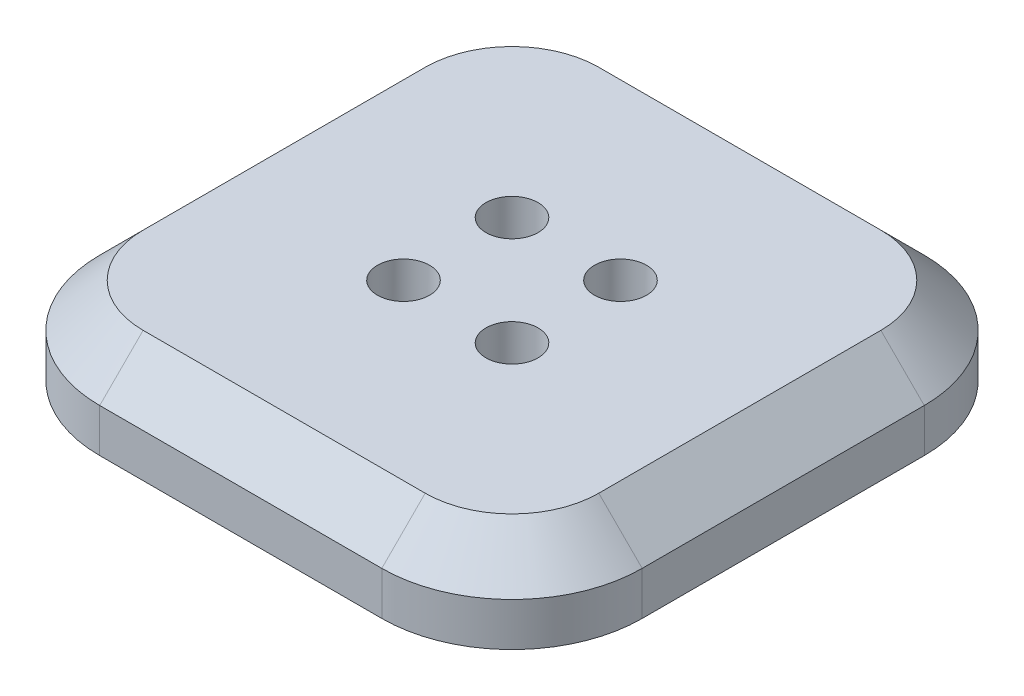
ISO-10303-21;
HEADER;
FILE_DESCRIPTION(('STEP AP214'),'2;1');
FILE_NAME('part.step','',(''),(''),'','','');
FILE_SCHEMA(('AUTOMOTIVE_DESIGN { 1 0 10303 214 1 1 1 1 }'));
ENDSEC;
DATA;
#1=APPLICATION_CONTEXT('core data for automotive mechanical design processes');
#2=APPLICATION_PROTOCOL_DEFINITION('international standard','automotive_design',2000,#1);
#3=PRODUCT_CONTEXT('',#1,'mechanical');
#4=PRODUCT('Part','Part','',(#3));
#5=PRODUCT_RELATED_PRODUCT_CATEGORY('part','',(#4));
#6=PRODUCT_DEFINITION_FORMATION('','',#4);
#7=PRODUCT_DEFINITION_CONTEXT('part definition',#1,'design');
#8=PRODUCT_DEFINITION('design','',#6,#7);
#9=PRODUCT_DEFINITION_SHAPE('','',#8);
#10=(LENGTH_UNIT() NAMED_UNIT(*) SI_UNIT(.MILLI.,.METRE.));
#11=(NAMED_UNIT(*) PLANE_ANGLE_UNIT() SI_UNIT($,.RADIAN.));
#12=(NAMED_UNIT(*) SI_UNIT($,.STERADIAN.) SOLID_ANGLE_UNIT());
#13=UNCERTAINTY_MEASURE_WITH_UNIT(LENGTH_MEASURE(1.E-05),#10,'distance_accuracy_value','');
#14=(GEOMETRIC_REPRESENTATION_CONTEXT(3) GLOBAL_UNCERTAINTY_ASSIGNED_CONTEXT((#13)) GLOBAL_UNIT_ASSIGNED_CONTEXT((#10,
#11,#12)) REPRESENTATION_CONTEXT('',''));
#15=CARTESIAN_POINT('',(0.,0.,0.));
#16=DIRECTION('',(0.,0.,1.));
#17=DIRECTION('',(1.,0.,0.));
#18=AXIS2_PLACEMENT_3D('',#15,#16,#17);
#19=CARTESIAN_POINT('',(-32.5000000000001,10.,32.5000000000001));
#20=DIRECTION('',(0.,-1.,0.));
#21=DIRECTION('',(0.,0.,-1.));
#22=AXIS2_PLACEMENT_3D('',#19,#20,#21);
#23=CYLINDRICAL_SURFACE('',#22,30.);
#24=DIRECTION('',(0.,-1.,0.));
#25=VECTOR('',#24,1.);
#26=CARTESIAN_POINT('',(-32.5000000000001,10.,62.5000000000001));
#27=LINE('',#26,#25);
#28=CARTESIAN_POINT('',(-32.5000000000001,0.,62.5000000000001));
#29=VERTEX_POINT('',#28);
#30=CARTESIAN_POINT('',(-32.5000000000001,-10.,62.5000000000001));
#31=VERTEX_POINT('',#30);
#32=EDGE_CURVE('E133',#29,#31,#27,.T.);
#33=ORIENTED_EDGE('',*,*,#32,.F.);
#34=CARTESIAN_POINT('',(-32.5000000000001,0.,32.5000000000001));
#35=DIRECTION('',(0.,-1.,0.));
#36=DIRECTION('',(0.,0.,-1.));
#37=AXIS2_PLACEMENT_3D('',#34,#35,#36);
#38=CIRCLE('',#37,30.);
#39=CARTESIAN_POINT('',(-62.5,0.,32.5000000000001));
#40=VERTEX_POINT('',#39);
#41=EDGE_CURVE('E12',#29,#40,#38,.T.);
#42=ORIENTED_EDGE('',*,*,#41,.T.);
#43=DIRECTION('',(0.,-1.,0.));
#44=VECTOR('',#43,1.);
#45=CARTESIAN_POINT('',(-62.5,10.,32.5000000000001));
#46=LINE('',#45,#44);
#47=CARTESIAN_POINT('',(-62.5,-10.,32.5000000000001));
#48=VERTEX_POINT('',#47);
#49=EDGE_CURVE('E156',#40,#48,#46,.T.);
#50=ORIENTED_EDGE('',*,*,#49,.T.);
#51=CARTESIAN_POINT('',(-32.5000000000001,-10.,32.5000000000001));
#52=DIRECTION('',(0.,1.,0.));
#53=DIRECTION('',(0.,0.,-1.));
#54=AXIS2_PLACEMENT_3D('',#51,#52,#53);
#55=CIRCLE('',#54,30.);
#56=EDGE_CURVE('E149',#48,#31,#55,.T.);
#57=ORIENTED_EDGE('',*,*,#56,.T.);
#58=EDGE_LOOP('',(#33,#42,#50,#57));
#59=FACE_BOUND('',#58,.T.);
#60=ADVANCED_FACE('F43',(#59),#23,.T.);
#61=CARTESIAN_POINT('',(32.5000000000001,10.,62.5000000000001));
#62=DIRECTION('',(0.,0.,-1.));
#63=DIRECTION('',(-1.,0.,0.));
#64=AXIS2_PLACEMENT_3D('',#61,#62,#63);
#65=PLANE('',#64);
#66=DIRECTION('',(0.,-1.,0.));
#67=VECTOR('',#66,1.);
#68=CARTESIAN_POINT('',(32.5000000000001,10.,62.5000000000001));
#69=LINE('',#68,#67);
#70=CARTESIAN_POINT('',(32.5000000000001,0.,62.5000000000001));
#71=VERTEX_POINT('',#70);
#72=CARTESIAN_POINT('',(32.5000000000001,-10.,62.5000000000001));
#73=VERTEX_POINT('',#72);
#74=EDGE_CURVE('E143',#71,#73,#69,.T.);
#75=ORIENTED_EDGE('',*,*,#74,.F.);
#76=DIRECTION('',(-1.,0.,0.));
#77=VECTOR('',#76,1.);
#78=CARTESIAN_POINT('',(32.5000000000001,0.,62.5000000000001));
#79=LINE('',#78,#77);
#80=EDGE_CURVE('E54',#71,#29,#79,.T.);
#81=ORIENTED_EDGE('',*,*,#80,.T.);
#82=ORIENTED_EDGE('',*,*,#32,.T.);
#83=DIRECTION('',(1.,0.,0.));
#84=VECTOR('',#83,1.);
#85=CARTESIAN_POINT('',(32.5000000000001,-10.,62.5000000000001));
#86=LINE('',#85,#84);
#87=EDGE_CURVE('E136',#31,#73,#86,.T.);
#88=ORIENTED_EDGE('',*,*,#87,.T.);
#89=EDGE_LOOP('',(#75,#81,#82,#88));
#90=FACE_BOUND('',#89,.T.);
#91=ADVANCED_FACE('F135',(#90),#65,.F.);
#92=CARTESIAN_POINT('',(32.5000000000001,10.,32.5000000000001));
#93=DIRECTION('',(0.,-1.,0.));
#94=DIRECTION('',(0.,0.,-1.));
#95=AXIS2_PLACEMENT_3D('',#92,#93,#94);
#96=CYLINDRICAL_SURFACE('',#95,30.);
#97=DIRECTION('',(0.,-1.,0.));
#98=VECTOR('',#97,1.);
#99=CARTESIAN_POINT('',(62.5000000000001,10.,32.5000000000001));
#100=LINE('',#99,#98);
#101=CARTESIAN_POINT('',(62.5000000000001,0.,32.5000000000001));
#102=VERTEX_POINT('',#101);
#103=CARTESIAN_POINT('',(62.5000000000001,-10.,32.5000000000001));
#104=VERTEX_POINT('',#103);
#105=EDGE_CURVE('E202',#102,#104,#100,.T.);
#106=ORIENTED_EDGE('',*,*,#105,.F.);
#107=CARTESIAN_POINT('',(32.5000000000001,0.,32.5000000000001));
#108=DIRECTION('',(0.,-1.,0.));
#109=DIRECTION('',(0.,0.,-1.));
#110=AXIS2_PLACEMENT_3D('',#107,#108,#109);
#111=CIRCLE('',#110,30.);
#112=EDGE_CURVE('E69',#102,#71,#111,.T.);
#113=ORIENTED_EDGE('',*,*,#112,.T.);
#114=ORIENTED_EDGE('',*,*,#74,.T.);
#115=CARTESIAN_POINT('',(32.5000000000001,-10.,32.5000000000001));
#116=DIRECTION('',(0.,1.,0.));
#117=DIRECTION('',(0.,0.,-1.));
#118=AXIS2_PLACEMENT_3D('',#115,#116,#117);
#119=CIRCLE('',#118,30.);
#120=EDGE_CURVE('E152',#73,#104,#119,.T.);
#121=ORIENTED_EDGE('',*,*,#120,.T.);
#122=EDGE_LOOP('',(#106,#113,#114,#121));
#123=FACE_BOUND('',#122,.T.);
#124=ADVANCED_FACE('F329',(#123),#96,.T.);
#125=CARTESIAN_POINT('',(62.5,10.,-32.5000000000001));
#126=DIRECTION('',(-1.,0.,0.));
#127=DIRECTION('',(0.,0.,1.));
#128=AXIS2_PLACEMENT_3D('',#125,#126,#127);
#129=PLANE('',#128);
#130=DIRECTION('',(0.,-1.,0.));
#131=VECTOR('',#130,1.);
#132=CARTESIAN_POINT('',(62.5,10.,-32.5000000000001));
#133=LINE('',#132,#131);
#134=CARTESIAN_POINT('',(62.5,0.,-32.5000000000001));
#135=VERTEX_POINT('',#134);
#136=CARTESIAN_POINT('',(62.5,-10.,-32.5000000000001));
#137=VERTEX_POINT('',#136);
#138=EDGE_CURVE('E199',#135,#137,#133,.T.);
#139=ORIENTED_EDGE('',*,*,#138,.F.);
#140=DIRECTION('',(0.,0.,1.));
#141=VECTOR('',#140,1.);
#142=CARTESIAN_POINT('',(62.5,0.,-32.5000000000001));
#143=LINE('',#142,#141);
#144=EDGE_CURVE('E244',#135,#102,#143,.T.);
#145=ORIENTED_EDGE('',*,*,#144,.T.);
#146=ORIENTED_EDGE('',*,*,#105,.T.);
#147=DIRECTION('',(0.,0.,-1.));
#148=VECTOR('',#147,1.);
#149=CARTESIAN_POINT('',(62.5,-10.,-32.5000000000001));
#150=LINE('',#149,#148);
#151=EDGE_CURVE('E169',#104,#137,#150,.T.);
#152=ORIENTED_EDGE('',*,*,#151,.T.);
#153=EDGE_LOOP('',(#139,#145,#146,#152));
#154=FACE_BOUND('',#153,.T.);
#155=ADVANCED_FACE('F327',(#154),#129,.F.);
#156=CARTESIAN_POINT('',(32.5000000000001,10.,-32.5000000000001));
#157=DIRECTION('',(0.,-1.,0.));
#158=DIRECTION('',(0.,0.,-1.));
#159=AXIS2_PLACEMENT_3D('',#156,#157,#158);
#160=CYLINDRICAL_SURFACE('',#159,30.);
#161=DIRECTION('',(0.,-1.,0.));
#162=VECTOR('',#161,1.);
#163=CARTESIAN_POINT('',(32.5000000000001,10.,-62.5000000000001));
#164=LINE('',#163,#162);
#165=CARTESIAN_POINT('',(32.5000000000001,0.,-62.5000000000001));
#166=VERTEX_POINT('',#165);
#167=CARTESIAN_POINT('',(32.5000000000001,-10.,-62.5000000000001));
#168=VERTEX_POINT('',#167);
#169=EDGE_CURVE('E196',#166,#168,#164,.T.);
#170=ORIENTED_EDGE('',*,*,#169,.F.);
#171=CARTESIAN_POINT('',(32.5000000000001,0.,-32.5000000000001));
#172=DIRECTION('',(0.,-1.,0.));
#173=DIRECTION('',(0.,0.,-1.));
#174=AXIS2_PLACEMENT_3D('',#171,#172,#173);
#175=CIRCLE('',#174,30.);
#176=EDGE_CURVE('E241',#166,#135,#175,.T.);
#177=ORIENTED_EDGE('',*,*,#176,.T.);
#178=ORIENTED_EDGE('',*,*,#138,.T.);
#179=CARTESIAN_POINT('',(32.5000000000001,-10.,-32.5000000000001));
#180=DIRECTION('',(0.,1.,0.));
#181=DIRECTION('',(0.,0.,-1.));
#182=AXIS2_PLACEMENT_3D('',#179,#180,#181);
#183=CIRCLE('',#182,30.);
#184=EDGE_CURVE('E173',#137,#168,#183,.T.);
#185=ORIENTED_EDGE('',*,*,#184,.T.);
#186=EDGE_LOOP('',(#170,#177,#178,#185));
#187=FACE_BOUND('',#186,.T.);
#188=ADVANCED_FACE('F325',(#187),#160,.T.);
#189=CARTESIAN_POINT('',(-32.5000000000001,10.,-62.5000000000001));
#190=DIRECTION('',(0.,0.,1.));
#191=DIRECTION('',(1.,0.,0.));
#192=AXIS2_PLACEMENT_3D('',#189,#190,#191);
#193=PLANE('',#192);
#194=DIRECTION('',(0.,-1.,0.));
#195=VECTOR('',#194,1.);
#196=CARTESIAN_POINT('',(-32.5000000000001,10.,-62.5000000000001));
#197=LINE('',#196,#195);
#198=CARTESIAN_POINT('',(-32.5000000000001,0.,-62.5000000000001));
#199=VERTEX_POINT('',#198);
#200=CARTESIAN_POINT('',(-32.5000000000001,-10.,-62.5000000000001));
#201=VERTEX_POINT('',#200);
#202=EDGE_CURVE('E193',#199,#201,#197,.T.);
#203=ORIENTED_EDGE('',*,*,#202,.F.);
#204=DIRECTION('',(1.,0.,0.));
#205=VECTOR('',#204,1.);
#206=CARTESIAN_POINT('',(-32.5000000000001,0.,-62.5000000000001));
#207=LINE('',#206,#205);
#208=EDGE_CURVE('E238',#199,#166,#207,.T.);
#209=ORIENTED_EDGE('',*,*,#208,.T.);
#210=ORIENTED_EDGE('',*,*,#169,.T.);
#211=DIRECTION('',(-1.,0.,0.));
#212=VECTOR('',#211,1.);
#213=CARTESIAN_POINT('',(-32.5000000000001,-10.,-62.5000000000001));
#214=LINE('',#213,#212);
#215=EDGE_CURVE('E177',#168,#201,#214,.T.);
#216=ORIENTED_EDGE('',*,*,#215,.T.);
#217=EDGE_LOOP('',(#203,#209,#210,#216));
#218=FACE_BOUND('',#217,.T.);
#219=ADVANCED_FACE('F313',(#218),#193,.F.);
#220=CARTESIAN_POINT('',(-32.5000000000001,10.,-32.5000000000001));
#221=DIRECTION('',(0.,-1.,0.));
#222=DIRECTION('',(0.,0.,-1.));
#223=AXIS2_PLACEMENT_3D('',#220,#221,#222);
#224=CYLINDRICAL_SURFACE('',#223,30.);
#225=DIRECTION('',(0.,-1.,0.));
#226=VECTOR('',#225,1.);
#227=CARTESIAN_POINT('',(-62.5000000000001,10.,-32.5000000000001));
#228=LINE('',#227,#226);
#229=CARTESIAN_POINT('',(-62.5000000000001,0.,-32.5000000000001));
#230=VERTEX_POINT('',#229);
#231=CARTESIAN_POINT('',(-62.5000000000001,-10.,-32.5000000000001));
#232=VERTEX_POINT('',#231);
#233=EDGE_CURVE('E190',#230,#232,#228,.T.);
#234=ORIENTED_EDGE('',*,*,#233,.F.);
#235=CARTESIAN_POINT('',(-32.5000000000001,0.,-32.5000000000001));
#236=DIRECTION('',(0.,-1.,0.));
#237=DIRECTION('',(0.,0.,-1.));
#238=AXIS2_PLACEMENT_3D('',#235,#236,#237);
#239=CIRCLE('',#238,30.);
#240=EDGE_CURVE('E235',#230,#199,#239,.T.);
#241=ORIENTED_EDGE('',*,*,#240,.T.);
#242=ORIENTED_EDGE('',*,*,#202,.T.);
#243=CARTESIAN_POINT('',(-32.5000000000001,-10.,-32.5000000000001));
#244=DIRECTION('',(0.,1.,0.));
#245=DIRECTION('',(0.,0.,1.));
#246=AXIS2_PLACEMENT_3D('',#243,#244,#245);
#247=CIRCLE('',#246,30.);
#248=EDGE_CURVE('E181',#201,#232,#247,.T.);
#249=ORIENTED_EDGE('',*,*,#248,.T.);
#250=EDGE_LOOP('',(#234,#241,#242,#249));
#251=FACE_BOUND('',#250,.T.);
#252=ADVANCED_FACE('F310',(#251),#224,.T.);
#253=CARTESIAN_POINT('',(-62.5,10.,32.5000000000001));
#254=DIRECTION('',(1.,0.,0.));
#255=DIRECTION('',(0.,0.,-1.));
#256=AXIS2_PLACEMENT_3D('',#253,#254,#255);
#257=PLANE('',#256);
#258=ORIENTED_EDGE('',*,*,#49,.F.);
#259=DIRECTION('',(0.,0.,-1.));
#260=VECTOR('',#259,1.);
#261=CARTESIAN_POINT('',(-62.5,0.,32.5000000000001));
#262=LINE('',#261,#260);
#263=EDGE_CURVE('E231',#40,#230,#262,.T.);
#264=ORIENTED_EDGE('',*,*,#263,.T.);
#265=ORIENTED_EDGE('',*,*,#233,.T.);
#266=DIRECTION('',(0.,0.,1.));
#267=VECTOR('',#266,1.);
#268=CARTESIAN_POINT('',(-62.5,-10.,32.5000000000001));
#269=LINE('',#268,#267);
#270=EDGE_CURVE('E185',#232,#48,#269,.T.);
#271=ORIENTED_EDGE('',*,*,#270,.T.);
#272=EDGE_LOOP('',(#258,#264,#265,#271));
#273=FACE_BOUND('',#272,.T.);
#274=ADVANCED_FACE('F297',(#273),#257,.F.);
#275=CARTESIAN_POINT('',(-32.5000000000001,10.,32.5000000000001));
#276=DIRECTION('',(0.,-1.,0.));
#277=DIRECTION('',(0.,0.,-1.));
#278=AXIS2_PLACEMENT_3D('',#275,#276,#277);
#279=PLANE('',#278);
#280=CARTESIAN_POINT('',(-12.5,10.,-12.5000000000001));
#281=DIRECTION('',(0.,1.,0.));
#282=DIRECTION('',(0.,0.,-1.));
#283=AXIS2_PLACEMENT_3D('',#280,#281,#282);
#284=CIRCLE('',#283,6.);
#285=CARTESIAN_POINT('',(-12.5,10.,-18.5000000000001));
#286=VERTEX_POINT('',#285);
#287=EDGE_CURVE('E629',#286,#286,#284,.T.);
#288=ORIENTED_EDGE('',*,*,#287,.F.);
#289=EDGE_LOOP('',(#288));
#290=FACE_BOUND('',#289,.T.);
#291=CARTESIAN_POINT('',(12.5,10.,12.5000000000001));
#292=DIRECTION('',(0.,1.,0.));
#293=DIRECTION('',(0.,0.,-1.));
#294=AXIS2_PLACEMENT_3D('',#291,#292,#293);
#295=CIRCLE('',#294,6.00000000000001);
#296=CARTESIAN_POINT('',(12.5,10.,6.5000000000001));
#297=VERTEX_POINT('',#296);
#298=EDGE_CURVE('E628',#297,#297,#295,.T.);
#299=ORIENTED_EDGE('',*,*,#298,.F.);
#300=EDGE_LOOP('',(#299));
#301=FACE_BOUND('',#300,.T.);
#302=CARTESIAN_POINT('',(-12.5,10.,12.5000000000001));
#303=DIRECTION('',(0.,1.,0.));
#304=DIRECTION('',(0.,0.,1.));
#305=AXIS2_PLACEMENT_3D('',#302,#303,#304);
#306=CIRCLE('',#305,6.);
#307=CARTESIAN_POINT('',(-12.5,10.,18.5000000000001));
#308=VERTEX_POINT('',#307);
#309=EDGE_CURVE('E620',#308,#308,#306,.T.);
#310=ORIENTED_EDGE('',*,*,#309,.F.);
#311=EDGE_LOOP('',(#310));
#312=FACE_BOUND('',#311,.T.);
#313=CARTESIAN_POINT('',(12.5,10.,-12.5000000000001));
#314=DIRECTION('',(0.,1.,0.));
#315=DIRECTION('',(0.,0.,1.));
#316=AXIS2_PLACEMENT_3D('',#313,#314,#315);
#317=CIRCLE('',#316,6.00000000000001);
#318=CARTESIAN_POINT('',(12.5,10.,-6.5000000000001));
#319=VERTEX_POINT('',#318);
#320=EDGE_CURVE('E638',#319,#319,#317,.T.);
#321=ORIENTED_EDGE('',*,*,#320,.F.);
#322=EDGE_LOOP('',(#321));
#323=FACE_BOUND('',#322,.T.);
#324=CARTESIAN_POINT('',(-32.5000000000001,10.,-32.5000000000001));
#325=DIRECTION('',(0.,-1.,0.));
#326=DIRECTION('',(0.,0.,-1.));
#327=AXIS2_PLACEMENT_3D('',#324,#325,#326);
#328=CIRCLE('',#327,20.);
#329=CARTESIAN_POINT('',(-32.5000000000001,10.,-52.5000000000001));
#330=VERTEX_POINT('',#329);
#331=CARTESIAN_POINT('',(-52.5000000000001,10.,-32.5000000000001));
#332=VERTEX_POINT('',#331);
#333=EDGE_CURVE('E224',#330,#332,#328,.F.);
#334=ORIENTED_EDGE('',*,*,#333,.T.);
#335=DIRECTION('',(0.,0.,1.));
#336=VECTOR('',#335,1.);
#337=CARTESIAN_POINT('',(-52.5,10.,32.5000000000001));
#338=LINE('',#337,#336);
#339=CARTESIAN_POINT('',(-52.5,10.,32.5000000000001));
#340=VERTEX_POINT('',#339);
#341=EDGE_CURVE('E227',#332,#340,#338,.T.);
#342=ORIENTED_EDGE('',*,*,#341,.T.);
#343=CARTESIAN_POINT('',(-32.5000000000001,10.,32.5000000000001));
#344=DIRECTION('',(0.,-1.,0.));
#345=DIRECTION('',(0.,0.,-1.));
#346=AXIS2_PLACEMENT_3D('',#343,#344,#345);
#347=CIRCLE('',#346,20.);
#348=CARTESIAN_POINT('',(-32.5000000000001,10.,52.5000000000001));
#349=VERTEX_POINT('',#348);
#350=EDGE_CURVE('E142',#340,#349,#347,.F.);
#351=ORIENTED_EDGE('',*,*,#350,.T.);
#352=DIRECTION('',(1.,0.,0.));
#353=VECTOR('',#352,1.);
#354=CARTESIAN_POINT('',(-32.5000000000001,10.,52.5000000000001));
#355=LINE('',#354,#353);
#356=CARTESIAN_POINT('',(32.5000000000001,10.,52.5000000000001));
#357=VERTEX_POINT('',#356);
#358=EDGE_CURVE('E209',#349,#357,#355,.T.);
#359=ORIENTED_EDGE('',*,*,#358,.T.);
#360=CARTESIAN_POINT('',(32.5000000000001,10.,32.5000000000001));
#361=DIRECTION('',(0.,-1.,0.));
#362=DIRECTION('',(0.,0.,-1.));
#363=AXIS2_PLACEMENT_3D('',#360,#361,#362);
#364=CIRCLE('',#363,20.);
#365=CARTESIAN_POINT('',(52.5,10.,32.5000000000001));
#366=VERTEX_POINT('',#365);
#367=EDGE_CURVE('E212',#357,#366,#364,.F.);
#368=ORIENTED_EDGE('',*,*,#367,.T.);
#369=DIRECTION('',(0.,0.,-1.));
#370=VECTOR('',#369,1.);
#371=CARTESIAN_POINT('',(52.5,10.,32.5000000000001));
#372=LINE('',#371,#370);
#373=CARTESIAN_POINT('',(52.5,10.,-32.5000000000001));
#374=VERTEX_POINT('',#373);
#375=EDGE_CURVE('E215',#366,#374,#372,.T.);
#376=ORIENTED_EDGE('',*,*,#375,.T.);
#377=CARTESIAN_POINT('',(32.5000000000001,10.,-32.5000000000001));
#378=DIRECTION('',(0.,-1.,0.));
#379=DIRECTION('',(0.,0.,-1.));
#380=AXIS2_PLACEMENT_3D('',#377,#378,#379);
#381=CIRCLE('',#380,20.);
#382=CARTESIAN_POINT('',(32.5000000000001,10.,-52.5000000000001));
#383=VERTEX_POINT('',#382);
#384=EDGE_CURVE('E218',#374,#383,#381,.F.);
#385=ORIENTED_EDGE('',*,*,#384,.T.);
#386=DIRECTION('',(-1.,0.,0.));
#387=VECTOR('',#386,1.);
#388=CARTESIAN_POINT('',(-32.5000000000001,10.,-52.5000000000001));
#389=LINE('',#388,#387);
#390=EDGE_CURVE('E221',#383,#330,#389,.T.);
#391=ORIENTED_EDGE('',*,*,#390,.T.);
#392=EDGE_LOOP('',(#334,#342,#351,#359,#368,#376,#385,#391));
#393=FACE_BOUND('',#392,.T.);
#394=ADVANCED_FACE('F285',(#290,#301,#312,#323,#393),#279,.F.);
#395=CARTESIAN_POINT('',(-32.5000000000001,-10.,32.5000000000001));
#396=DIRECTION('',(0.,-1.,0.));
#397=DIRECTION('',(0.,0.,-1.));
#398=AXIS2_PLACEMENT_3D('',#395,#396,#397);
#399=PLANE('',#398);
#400=CARTESIAN_POINT('',(-37.5,-10.,37.5000000000001));
#401=DIRECTION('',(0.,-1.,0.));
#402=DIRECTION('',(0.,0.,1.));
#403=AXIS2_PLACEMENT_3D('',#400,#401,#402);
#404=CIRCLE('',#403,6.);
#405=CARTESIAN_POINT('',(-37.5,-10.,43.5000000000001));
#406=VERTEX_POINT('',#405);
#407=EDGE_CURVE('E597',#406,#406,#404,.T.);
#408=ORIENTED_EDGE('',*,*,#407,.F.);
#409=EDGE_LOOP('',(#408));
#410=FACE_BOUND('',#409,.T.);
#411=CARTESIAN_POINT('',(37.5,-10.,-37.5000000000001));
#412=DIRECTION('',(0.,-1.,0.));
#413=DIRECTION('',(0.,0.,1.));
#414=AXIS2_PLACEMENT_3D('',#411,#412,#413);
#415=CIRCLE('',#414,6.);
#416=CARTESIAN_POINT('',(37.5,-10.,-31.5000000000001));
#417=VERTEX_POINT('',#416);
#418=EDGE_CURVE('E609',#417,#417,#415,.T.);
#419=ORIENTED_EDGE('',*,*,#418,.F.);
#420=EDGE_LOOP('',(#419));
#421=FACE_BOUND('',#420,.T.);
#422=CARTESIAN_POINT('',(-37.5,-10.,-37.5000000000001));
#423=DIRECTION('',(0.,-1.,0.));
#424=DIRECTION('',(0.,0.,-1.));
#425=AXIS2_PLACEMENT_3D('',#422,#423,#424);
#426=CIRCLE('',#425,6.);
#427=CARTESIAN_POINT('',(-37.5,-10.,-43.5000000000001));
#428=VERTEX_POINT('',#427);
#429=EDGE_CURVE('E673',#428,#428,#426,.T.);
#430=ORIENTED_EDGE('',*,*,#429,.F.);
#431=EDGE_LOOP('',(#430));
#432=FACE_BOUND('',#431,.T.);
#433=CARTESIAN_POINT('',(37.5,-10.,37.5000000000001));
#434=DIRECTION('',(0.,-1.,0.));
#435=DIRECTION('',(0.,0.,-1.));
#436=AXIS2_PLACEMENT_3D('',#433,#434,#435);
#437=CIRCLE('',#436,6.);
#438=CARTESIAN_POINT('',(37.5,-10.,31.5000000000001));
#439=VERTEX_POINT('',#438);
#440=EDGE_CURVE('E596',#439,#439,#437,.T.);
#441=ORIENTED_EDGE('',*,*,#440,.F.);
#442=EDGE_LOOP('',(#441));
#443=FACE_BOUND('',#442,.T.);
#444=ORIENTED_EDGE('',*,*,#56,.F.);
#445=ORIENTED_EDGE('',*,*,#270,.F.);
#446=ORIENTED_EDGE('',*,*,#248,.F.);
#447=ORIENTED_EDGE('',*,*,#215,.F.);
#448=ORIENTED_EDGE('',*,*,#184,.F.);
#449=ORIENTED_EDGE('',*,*,#151,.F.);
#450=ORIENTED_EDGE('',*,*,#120,.F.);
#451=ORIENTED_EDGE('',*,*,#87,.F.);
#452=EDGE_LOOP('',(#444,#445,#446,#447,#448,#449,#450,#451));
#453=FACE_BOUND('',#452,.T.);
#454=ADVANCED_FACE('F147',(#410,#421,#432,#443,#453),#399,.T.);
#455=CARTESIAN_POINT('',(52.5,10.,32.5000000000001));
#456=DIRECTION('',(-0.707106781186549,-0.707106781186546,0.));
#457=DIRECTION('',(0.,0.,-1.));
#458=AXIS2_PLACEMENT_3D('',#455,#456,#457);
#459=PLANE('',#458);
#460=DIRECTION('',(-0.707106781186546,0.707106781186549,0.));
#461=VECTOR('',#460,1.);
#462=CARTESIAN_POINT('',(62.5,0.,32.5000000000001));
#463=LINE('',#462,#461);
#464=EDGE_CURVE('E162',#102,#366,#463,.T.);
#465=ORIENTED_EDGE('',*,*,#464,.F.);
#466=ORIENTED_EDGE('',*,*,#144,.F.);
#467=DIRECTION('',(0.707106781186546,-0.707106781186549,0.));
#468=VECTOR('',#467,1.);
#469=CARTESIAN_POINT('',(52.5,10.,-32.5000000000001));
#470=LINE('',#469,#468);
#471=EDGE_CURVE('E48',#374,#135,#470,.T.);
#472=ORIENTED_EDGE('',*,*,#471,.F.);
#473=ORIENTED_EDGE('',*,*,#375,.F.);
#474=EDGE_LOOP('',(#465,#466,#472,#473));
#475=FACE_BOUND('',#474,.T.);
#476=ADVANCED_FACE('F46',(#475),#459,.F.);
#477=CARTESIAN_POINT('',(32.5000000000001,10.,-32.5000000000001));
#478=DIRECTION('',(0.,-1.,0.));
#479=DIRECTION('',(0.,0.,-1.));
#480=AXIS2_PLACEMENT_3D('',#477,#478,#479);
#481=CONICAL_SURFACE('',#480,20.,0.785398163397446);
#482=ORIENTED_EDGE('',*,*,#471,.T.);
#483=ORIENTED_EDGE('',*,*,#176,.F.);
#484=DIRECTION('',(0.,-0.707106781186549,-0.707106781186546));
#485=VECTOR('',#484,1.);
#486=CARTESIAN_POINT('',(32.5000000000001,10.,-52.5000000000001));
#487=LINE('',#486,#485);
#488=EDGE_CURVE('E269',#383,#166,#487,.T.);
#489=ORIENTED_EDGE('',*,*,#488,.F.);
#490=ORIENTED_EDGE('',*,*,#384,.F.);
#491=EDGE_LOOP('',(#482,#483,#489,#490));
#492=FACE_BOUND('',#491,.T.);
#493=ADVANCED_FACE('F322',(#492),#481,.T.);
#494=CARTESIAN_POINT('',(32.5000000000001,10.,32.5000000000001));
#495=DIRECTION('',(0.,-1.,0.));
#496=DIRECTION('',(0.,0.,-1.));
#497=AXIS2_PLACEMENT_3D('',#494,#495,#496);
#498=CONICAL_SURFACE('',#497,20.,0.785398163397446);
#499=ORIENTED_EDGE('',*,*,#464,.T.);
#500=ORIENTED_EDGE('',*,*,#367,.F.);
#501=DIRECTION('',(0.,0.707106781186549,-0.707106781186546));
#502=VECTOR('',#501,1.);
#503=CARTESIAN_POINT('',(32.5000000000001,0.,62.5000000000001));
#504=LINE('',#503,#502);
#505=EDGE_CURVE('E265',#71,#357,#504,.T.);
#506=ORIENTED_EDGE('',*,*,#505,.F.);
#507=ORIENTED_EDGE('',*,*,#112,.F.);
#508=EDGE_LOOP('',(#499,#500,#506,#507));
#509=FACE_BOUND('',#508,.T.);
#510=ADVANCED_FACE('F277',(#509),#498,.T.);
#511=CARTESIAN_POINT('',(-32.5000000000001,10.,-52.5000000000001));
#512=DIRECTION('',(0.,-0.707106781186546,0.707106781186549));
#513=DIRECTION('',(-1.,0.,0.));
#514=AXIS2_PLACEMENT_3D('',#511,#512,#513);
#515=PLANE('',#514);
#516=ORIENTED_EDGE('',*,*,#488,.T.);
#517=ORIENTED_EDGE('',*,*,#208,.F.);
#518=DIRECTION('',(0.,-0.707106781186549,-0.707106781186546));
#519=VECTOR('',#518,1.);
#520=CARTESIAN_POINT('',(-32.5000000000001,10.,-52.5000000000001));
#521=LINE('',#520,#519);
#522=EDGE_CURVE('E261',#330,#199,#521,.T.);
#523=ORIENTED_EDGE('',*,*,#522,.F.);
#524=ORIENTED_EDGE('',*,*,#390,.F.);
#525=EDGE_LOOP('',(#516,#517,#523,#524));
#526=FACE_BOUND('',#525,.T.);
#527=ADVANCED_FACE('F318',(#526),#515,.F.);
#528=CARTESIAN_POINT('',(-32.5000000000001,10.,52.5000000000001));
#529=DIRECTION('',(0.,-0.707106781186546,-0.707106781186549));
#530=DIRECTION('',(1.,0.,0.));
#531=AXIS2_PLACEMENT_3D('',#528,#529,#530);
#532=PLANE('',#531);
#533=ORIENTED_EDGE('',*,*,#505,.T.);
#534=ORIENTED_EDGE('',*,*,#358,.F.);
#535=DIRECTION('',(0.,0.707106781186549,-0.707106781186546));
#536=VECTOR('',#535,1.);
#537=CARTESIAN_POINT('',(-32.5000000000001,0.,62.5000000000001));
#538=LINE('',#537,#536);
#539=EDGE_CURVE('E257',#29,#349,#538,.T.);
#540=ORIENTED_EDGE('',*,*,#539,.F.);
#541=ORIENTED_EDGE('',*,*,#80,.F.);
#542=EDGE_LOOP('',(#533,#534,#540,#541));
#543=FACE_BOUND('',#542,.T.);
#544=ADVANCED_FACE('F290',(#543),#532,.F.);
#545=CARTESIAN_POINT('',(-32.5000000000001,10.,-32.5000000000001));
#546=DIRECTION('',(0.,-1.,0.));
#547=DIRECTION('',(0.,0.,-1.));
#548=AXIS2_PLACEMENT_3D('',#545,#546,#547);
#549=CONICAL_SURFACE('',#548,20.,0.785398163397446);
#550=ORIENTED_EDGE('',*,*,#522,.T.);
#551=ORIENTED_EDGE('',*,*,#240,.F.);
#552=DIRECTION('',(-0.707106781186546,-0.707106781186549,0.));
#553=VECTOR('',#552,1.);
#554=CARTESIAN_POINT('',(-52.5000000000001,10.,-32.5000000000001));
#555=LINE('',#554,#553);
#556=EDGE_CURVE('E254',#332,#230,#555,.T.);
#557=ORIENTED_EDGE('',*,*,#556,.F.);
#558=ORIENTED_EDGE('',*,*,#333,.F.);
#559=EDGE_LOOP('',(#550,#551,#557,#558));
#560=FACE_BOUND('',#559,.T.);
#561=ADVANCED_FACE('F306',(#560),#549,.T.);
#562=CARTESIAN_POINT('',(-32.5000000000001,10.,32.5000000000001));
#563=DIRECTION('',(0.,-1.,0.));
#564=DIRECTION('',(0.,0.,-1.));
#565=AXIS2_PLACEMENT_3D('',#562,#563,#564);
#566=CONICAL_SURFACE('',#565,20.,0.785398163397446);
#567=ORIENTED_EDGE('',*,*,#539,.T.);
#568=ORIENTED_EDGE('',*,*,#350,.F.);
#569=DIRECTION('',(0.707106781186546,0.707106781186549,0.));
#570=VECTOR('',#569,1.);
#571=CARTESIAN_POINT('',(-62.5000000000001,0.,32.5000000000001));
#572=LINE('',#571,#570);
#573=EDGE_CURVE('E251',#40,#340,#572,.T.);
#574=ORIENTED_EDGE('',*,*,#573,.F.);
#575=ORIENTED_EDGE('',*,*,#41,.F.);
#576=EDGE_LOOP('',(#567,#568,#574,#575));
#577=FACE_BOUND('',#576,.T.);
#578=ADVANCED_FACE('F293',(#577),#566,.T.);
#579=CARTESIAN_POINT('',(-52.5,10.,32.5000000000001));
#580=DIRECTION('',(0.707106781186549,-0.707106781186546,0.));
#581=DIRECTION('',(0.,0.,1.));
#582=AXIS2_PLACEMENT_3D('',#579,#580,#581);
#583=PLANE('',#582);
#584=ORIENTED_EDGE('',*,*,#556,.T.);
#585=ORIENTED_EDGE('',*,*,#263,.F.);
#586=ORIENTED_EDGE('',*,*,#573,.T.);
#587=ORIENTED_EDGE('',*,*,#341,.F.);
#588=EDGE_LOOP('',(#584,#585,#586,#587));
#589=FACE_BOUND('',#588,.T.);
#590=ADVANCED_FACE('F300',(#589),#583,.F.);
#591=CARTESIAN_POINT('',(-32.5000000000001,0.,32.5000000000001));
#592=DIRECTION('',(0.,-1.,0.));
#593=DIRECTION('',(0.,0.,-1.));
#594=AXIS2_PLACEMENT_3D('',#591,#592,#593);
#595=PLANE('',#594);
#596=CARTESIAN_POINT('',(12.5,0.,-12.5000000000001));
#597=DIRECTION('',(0.,-1.,0.));
#598=DIRECTION('',(0.,0.,-1.));
#599=AXIS2_PLACEMENT_3D('',#596,#597,#598);
#600=CIRCLE('',#599,6.00000000000001);
#601=CARTESIAN_POINT('',(12.5,0.,-18.5000000000001));
#602=VERTEX_POINT('',#601);
#603=EDGE_CURVE('E164',#602,#602,#600,.F.);
#604=ORIENTED_EDGE('',*,*,#603,.T.);
#605=EDGE_LOOP('',(#604));
#606=FACE_BOUND('',#605,.T.);
#607=ADVANCED_FACE('F349',(#606),#595,.F.);
#608=CARTESIAN_POINT('',(12.5,-26.9705627484772,-12.5000000000001));
#609=DIRECTION('',(0.,1.,0.));
#610=DIRECTION('',(0.,0.,1.));
#611=AXIS2_PLACEMENT_3D('',#608,#609,#610);
#612=CYLINDRICAL_SURFACE('',#611,6.00000000000001);
#613=ORIENTED_EDGE('',*,*,#320,.T.);
#614=EDGE_LOOP('',(#613));
#615=FACE_BOUND('',#614,.T.);
#616=ORIENTED_EDGE('',*,*,#603,.F.);
#617=EDGE_LOOP('',(#616));
#618=FACE_BOUND('',#617,.T.);
#619=ADVANCED_FACE('F435',(#615,#618),#612,.F.);
#620=CARTESIAN_POINT('',(-32.5000000000001,0.,32.5000000000001));
#621=DIRECTION('',(0.,-1.,0.));
#622=DIRECTION('',(0.,0.,-1.));
#623=AXIS2_PLACEMENT_3D('',#620,#621,#622);
#624=PLANE('',#623);
#625=CARTESIAN_POINT('',(-12.5,0.,12.5000000000001));
#626=DIRECTION('',(0.,-1.,0.));
#627=DIRECTION('',(0.,0.,-1.));
#628=AXIS2_PLACEMENT_3D('',#625,#626,#627);
#629=CIRCLE('',#628,6.);
#630=CARTESIAN_POINT('',(-12.5,0.,6.5000000000001));
#631=VERTEX_POINT('',#630);
#632=EDGE_CURVE('E624',#631,#631,#629,.F.);
#633=ORIENTED_EDGE('',*,*,#632,.T.);
#634=EDGE_LOOP('',(#633));
#635=FACE_BOUND('',#634,.T.);
#636=ADVANCED_FACE('F444',(#635),#624,.F.);
#637=CARTESIAN_POINT('',(-12.5,-26.9705627484772,12.5000000000001));
#638=DIRECTION('',(0.,1.,0.));
#639=DIRECTION('',(0.,0.,1.));
#640=AXIS2_PLACEMENT_3D('',#637,#638,#639);
#641=CYLINDRICAL_SURFACE('',#640,6.);
#642=ORIENTED_EDGE('',*,*,#309,.T.);
#643=EDGE_LOOP('',(#642));
#644=FACE_BOUND('',#643,.T.);
#645=ORIENTED_EDGE('',*,*,#632,.F.);
#646=EDGE_LOOP('',(#645));
#647=FACE_BOUND('',#646,.T.);
#648=ADVANCED_FACE('F454',(#644,#647),#641,.F.);
#649=CARTESIAN_POINT('',(-32.5000000000001,0.,32.5000000000001));
#650=DIRECTION('',(0.,-1.,0.));
#651=DIRECTION('',(0.,0.,-1.));
#652=AXIS2_PLACEMENT_3D('',#649,#650,#651);
#653=PLANE('',#652);
#654=CARTESIAN_POINT('',(12.5,0.,12.5000000000001));
#655=DIRECTION('',(0.,-1.,0.));
#656=DIRECTION('',(0.,0.,-1.));
#657=AXIS2_PLACEMENT_3D('',#654,#655,#656);
#658=CIRCLE('',#657,6.00000000000001);
#659=CARTESIAN_POINT('',(12.5,0.,6.5000000000001));
#660=VERTEX_POINT('',#659);
#661=EDGE_CURVE('E634',#660,#660,#658,.F.);
#662=ORIENTED_EDGE('',*,*,#661,.T.);
#663=EDGE_LOOP('',(#662));
#664=FACE_BOUND('',#663,.T.);
#665=ADVANCED_FACE('F464',(#664),#653,.F.);
#666=CARTESIAN_POINT('',(12.5,-26.9705627484772,12.5000000000001));
#667=DIRECTION('',(0.,1.,0.));
#668=DIRECTION('',(0.,0.,1.));
#669=AXIS2_PLACEMENT_3D('',#666,#667,#668);
#670=CYLINDRICAL_SURFACE('',#669,6.00000000000001);
#671=ORIENTED_EDGE('',*,*,#298,.T.);
#672=EDGE_LOOP('',(#671));
#673=FACE_BOUND('',#672,.T.);
#674=ORIENTED_EDGE('',*,*,#661,.F.);
#675=EDGE_LOOP('',(#674));
#676=FACE_BOUND('',#675,.T.);
#677=ADVANCED_FACE('F474',(#673,#676),#670,.F.);
#678=CARTESIAN_POINT('',(-32.5000000000001,0.,32.5000000000001));
#679=DIRECTION('',(0.,-1.,0.));
#680=DIRECTION('',(0.,0.,-1.));
#681=AXIS2_PLACEMENT_3D('',#678,#679,#680);
#682=PLANE('',#681);
#683=CARTESIAN_POINT('',(-12.5,0.,-12.5000000000001));
#684=DIRECTION('',(0.,-1.,0.));
#685=DIRECTION('',(0.,0.,-1.));
#686=AXIS2_PLACEMENT_3D('',#683,#684,#685);
#687=CIRCLE('',#686,6.);
#688=CARTESIAN_POINT('',(-12.5,0.,-18.5000000000001));
#689=VERTEX_POINT('',#688);
#690=EDGE_CURVE('E633',#689,#689,#687,.F.);
#691=ORIENTED_EDGE('',*,*,#690,.T.);
#692=EDGE_LOOP('',(#691));
#693=FACE_BOUND('',#692,.T.);
#694=ADVANCED_FACE('F484',(#693),#682,.F.);
#695=CARTESIAN_POINT('',(-12.5,-26.9705627484772,-12.5000000000001));
#696=DIRECTION('',(0.,1.,0.));
#697=DIRECTION('',(0.,0.,1.));
#698=AXIS2_PLACEMENT_3D('',#695,#696,#697);
#699=CYLINDRICAL_SURFACE('',#698,6.);
#700=ORIENTED_EDGE('',*,*,#287,.T.);
#701=EDGE_LOOP('',(#700));
#702=FACE_BOUND('',#701,.T.);
#703=ORIENTED_EDGE('',*,*,#690,.F.);
#704=EDGE_LOOP('',(#703));
#705=FACE_BOUND('',#704,.T.);
#706=ADVANCED_FACE('F494',(#702,#705),#699,.F.);
#707=CARTESIAN_POINT('',(37.5,26.9705627484772,37.5000000000001));
#708=DIRECTION('',(0.,-1.,0.));
#709=DIRECTION('',(0.,0.,-1.));
#710=AXIS2_PLACEMENT_3D('',#707,#708,#709);
#711=CYLINDRICAL_SURFACE('',#710,6.);
#712=CARTESIAN_POINT('',(37.5,0.,37.5000000000001));
#713=DIRECTION('',(0.,-1.,0.));
#714=DIRECTION('',(0.,0.,-1.));
#715=AXIS2_PLACEMENT_3D('',#712,#713,#714);
#716=CIRCLE('',#715,6.);
#717=CARTESIAN_POINT('',(37.5,0.,31.5000000000001));
#718=VERTEX_POINT('',#717);
#719=EDGE_CURVE('E602',#718,#718,#716,.F.);
#720=ORIENTED_EDGE('',*,*,#719,.T.);
#721=EDGE_LOOP('',(#720));
#722=FACE_BOUND('',#721,.T.);
#723=ORIENTED_EDGE('',*,*,#440,.T.);
#724=EDGE_LOOP('',(#723));
#725=FACE_BOUND('',#724,.T.);
#726=ADVANCED_FACE('F503',(#722,#725),#711,.F.);
#727=CARTESIAN_POINT('',(-32.5000000000001,0.,32.5000000000001));
#728=DIRECTION('',(0.,-1.,0.));
#729=DIRECTION('',(0.,0.,-1.));
#730=AXIS2_PLACEMENT_3D('',#727,#728,#729);
#731=PLANE('',#730);
#732=ORIENTED_EDGE('',*,*,#719,.F.);
#733=EDGE_LOOP('',(#732));
#734=FACE_BOUND('',#733,.T.);
#735=ADVANCED_FACE('F518',(#734),#731,.T.);
#736=CARTESIAN_POINT('',(-37.5,26.9705627484772,-37.5000000000001));
#737=DIRECTION('',(0.,-1.,0.));
#738=DIRECTION('',(0.,0.,-1.));
#739=AXIS2_PLACEMENT_3D('',#736,#737,#738);
#740=CYLINDRICAL_SURFACE('',#739,6.);
#741=CARTESIAN_POINT('',(-37.5,0.,-37.5000000000001));
#742=DIRECTION('',(0.,-1.,0.));
#743=DIRECTION('',(0.,0.,-1.));
#744=AXIS2_PLACEMENT_3D('',#741,#742,#743);
#745=CIRCLE('',#744,6.);
#746=CARTESIAN_POINT('',(-37.5,0.,-43.5000000000001));
#747=VERTEX_POINT('',#746);
#748=EDGE_CURVE('E613',#747,#747,#745,.F.);
#749=ORIENTED_EDGE('',*,*,#748,.T.);
#750=EDGE_LOOP('',(#749));
#751=FACE_BOUND('',#750,.T.);
#752=ORIENTED_EDGE('',*,*,#429,.T.);
#753=EDGE_LOOP('',(#752));
#754=FACE_BOUND('',#753,.T.);
#755=ADVANCED_FACE('F528',(#751,#754),#740,.F.);
#756=CARTESIAN_POINT('',(-32.5000000000001,0.,32.5000000000001));
#757=DIRECTION('',(0.,-1.,0.));
#758=DIRECTION('',(0.,0.,-1.));
#759=AXIS2_PLACEMENT_3D('',#756,#757,#758);
#760=PLANE('',#759);
#761=ORIENTED_EDGE('',*,*,#748,.F.);
#762=EDGE_LOOP('',(#761));
#763=FACE_BOUND('',#762,.T.);
#764=ADVANCED_FACE('F538',(#763),#760,.T.);
#765=CARTESIAN_POINT('',(37.5,26.9705627484772,-37.5000000000001));
#766=DIRECTION('',(0.,-1.,0.));
#767=DIRECTION('',(0.,0.,-1.));
#768=AXIS2_PLACEMENT_3D('',#765,#766,#767);
#769=CYLINDRICAL_SURFACE('',#768,6.);
#770=CARTESIAN_POINT('',(37.5,0.,-37.5000000000001));
#771=DIRECTION('',(0.,-1.,0.));
#772=DIRECTION('',(0.,0.,-1.));
#773=AXIS2_PLACEMENT_3D('',#770,#771,#772);
#774=CIRCLE('',#773,6.);
#775=CARTESIAN_POINT('',(37.5,0.,-43.5000000000001));
#776=VERTEX_POINT('',#775);
#777=EDGE_CURVE('E605',#776,#776,#774,.F.);
#778=ORIENTED_EDGE('',*,*,#777,.T.);
#779=EDGE_LOOP('',(#778));
#780=FACE_BOUND('',#779,.T.);
#781=ORIENTED_EDGE('',*,*,#418,.T.);
#782=EDGE_LOOP('',(#781));
#783=FACE_BOUND('',#782,.T.);
#784=ADVANCED_FACE('F548',(#780,#783),#769,.F.);
#785=CARTESIAN_POINT('',(-32.5000000000001,0.,32.5000000000001));
#786=DIRECTION('',(0.,-1.,0.));
#787=DIRECTION('',(0.,0.,-1.));
#788=AXIS2_PLACEMENT_3D('',#785,#786,#787);
#789=PLANE('',#788);
#790=ORIENTED_EDGE('',*,*,#777,.F.);
#791=EDGE_LOOP('',(#790));
#792=FACE_BOUND('',#791,.T.);
#793=ADVANCED_FACE('F558',(#792),#789,.T.);
#794=CARTESIAN_POINT('',(-37.5,26.9705627484772,37.5000000000001));
#795=DIRECTION('',(0.,-1.,0.));
#796=DIRECTION('',(0.,0.,-1.));
#797=AXIS2_PLACEMENT_3D('',#794,#795,#796);
#798=CYLINDRICAL_SURFACE('',#797,6.);
#799=CARTESIAN_POINT('',(-37.5,0.,37.5000000000001));
#800=DIRECTION('',(0.,-1.,0.));
#801=DIRECTION('',(0.,0.,-1.));
#802=AXIS2_PLACEMENT_3D('',#799,#800,#801);
#803=CIRCLE('',#802,6.);
#804=CARTESIAN_POINT('',(-37.5,0.,31.5000000000001));
#805=VERTEX_POINT('',#804);
#806=EDGE_CURVE('E594',#805,#805,#803,.F.);
#807=ORIENTED_EDGE('',*,*,#806,.T.);
#808=EDGE_LOOP('',(#807));
#809=FACE_BOUND('',#808,.T.);
#810=ORIENTED_EDGE('',*,*,#407,.T.);
#811=EDGE_LOOP('',(#810));
#812=FACE_BOUND('',#811,.T.);
#813=ADVANCED_FACE('F568',(#809,#812),#798,.F.);
#814=CARTESIAN_POINT('',(-32.5000000000001,0.,32.5000000000001));
#815=DIRECTION('',(0.,-1.,0.));
#816=DIRECTION('',(0.,0.,-1.));
#817=AXIS2_PLACEMENT_3D('',#814,#815,#816);
#818=PLANE('',#817);
#819=ORIENTED_EDGE('',*,*,#806,.F.);
#820=EDGE_LOOP('',(#819));
#821=FACE_BOUND('',#820,.T.);
#822=ADVANCED_FACE('F578',(#821),#818,.T.);
#823=CLOSED_SHELL('',(#60,#91,#124,#155,#188,#219,#252,#274,#394,#454,#476,#493,#510,#527,#544,
#561,#578,#590,#607,#619,#636,#648,#665,#677,#694,#706,#726,#735,#755,#764,#784,#793,#813,#822));
#824=MANIFOLD_SOLID_BREP('B2',#823);
#825=ADVANCED_BREP_SHAPE_REPRESENTATION('',(#18,#824),#14);
#826=SHAPE_DEFINITION_REPRESENTATION(#9,#825);
ENDSEC;
END-ISO-10303-21;
